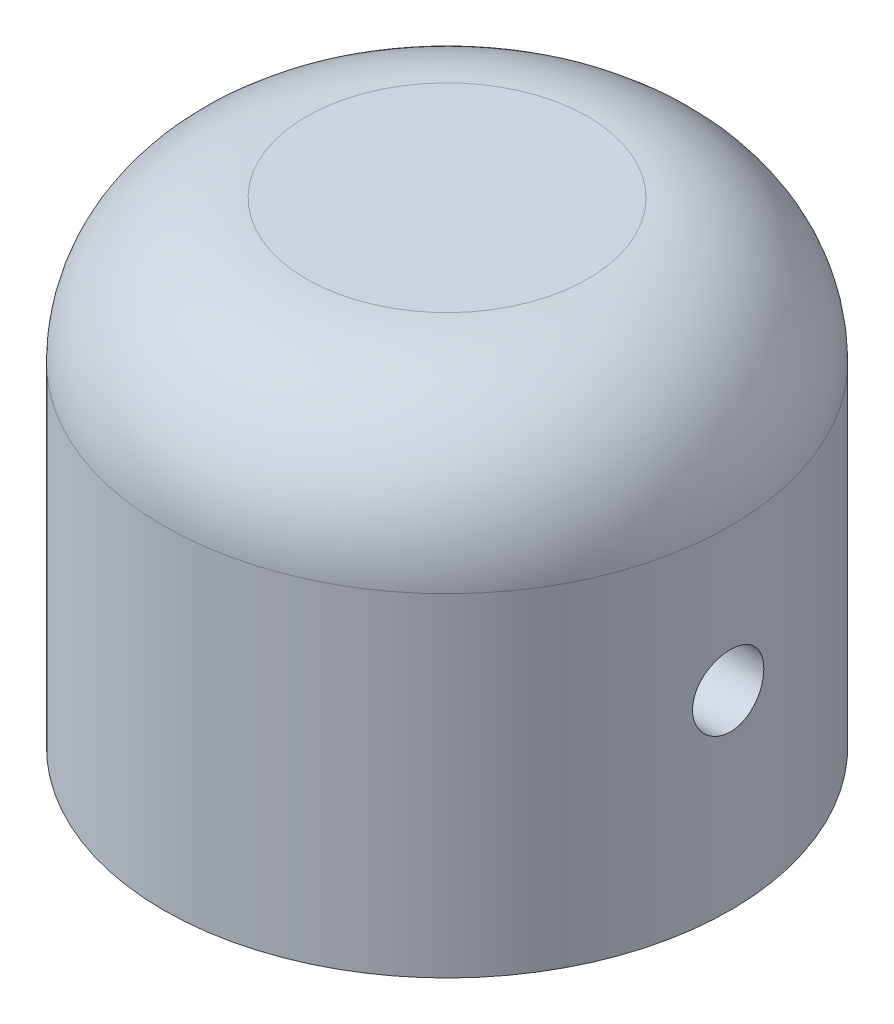
ISO-10303-21;
HEADER;
FILE_DESCRIPTION(('STEP AP214'),'2;1');
FILE_NAME('part.step','',(''),(''),'','','');
FILE_SCHEMA(('AUTOMOTIVE_DESIGN { 1 0 10303 214 1 1 1 1 }'));
ENDSEC;
DATA;
#1=APPLICATION_CONTEXT('core data for automotive mechanical design processes');
#2=APPLICATION_PROTOCOL_DEFINITION('international standard','automotive_design',2000,#1);
#3=PRODUCT_CONTEXT('',#1,'mechanical');
#4=PRODUCT('Part','Part','',(#3));
#5=PRODUCT_RELATED_PRODUCT_CATEGORY('part','',(#4));
#6=PRODUCT_DEFINITION_FORMATION('','',#4);
#7=PRODUCT_DEFINITION_CONTEXT('part definition',#1,'design');
#8=PRODUCT_DEFINITION('design','',#6,#7);
#9=PRODUCT_DEFINITION_SHAPE('','',#8);
#10=(LENGTH_UNIT() NAMED_UNIT(*) SI_UNIT(.MILLI.,.METRE.));
#11=(NAMED_UNIT(*) PLANE_ANGLE_UNIT() SI_UNIT($,.RADIAN.));
#12=(NAMED_UNIT(*) SI_UNIT($,.STERADIAN.) SOLID_ANGLE_UNIT());
#13=UNCERTAINTY_MEASURE_WITH_UNIT(LENGTH_MEASURE(1.E-05),#10,'distance_accuracy_value','');
#14=(GEOMETRIC_REPRESENTATION_CONTEXT(3) GLOBAL_UNCERTAINTY_ASSIGNED_CONTEXT((#13)) GLOBAL_UNIT_ASSIGNED_CONTEXT((#10,
#11,#12)) REPRESENTATION_CONTEXT('',''));
#15=CARTESIAN_POINT('',(0.,0.,0.));
#16=DIRECTION('',(0.,0.,1.));
#17=DIRECTION('',(1.,0.,0.));
#18=AXIS2_PLACEMENT_3D('',#15,#16,#17);
#19=CARTESIAN_POINT('',(0.,15.875,0.));
#20=DIRECTION('',(0.,1.,0.));
#21=DIRECTION('',(0.,0.,1.));
#22=AXIS2_PLACEMENT_3D('',#19,#20,#21);
#23=PLANE('',#22);
#24=CARTESIAN_POINT('',(0.,15.875,0.));
#25=DIRECTION('',(0.,1.,0.));
#26=DIRECTION('',(0.,0.,1.));
#27=AXIS2_PLACEMENT_3D('',#24,#25,#26);
#28=CIRCLE('',#27,4.699);
#29=CARTESIAN_POINT('',(0.,15.875,4.699));
#30=VERTEX_POINT('',#29);
#31=EDGE_CURVE('E42',#30,#30,#28,.T.);
#32=ORIENTED_EDGE('',*,*,#31,.T.);
#33=EDGE_LOOP('',(#32));
#34=FACE_BOUND('',#33,.T.);
#35=ADVANCED_FACE('F34',(#34),#23,.T.);
#36=CARTESIAN_POINT('',(0.,15.875,0.));
#37=DIRECTION('',(0.,-1.,0.));
#38=DIRECTION('',(0.,0.,-1.));
#39=AXIS2_PLACEMENT_3D('',#36,#37,#38);
#40=CYLINDRICAL_SURFACE('',#39,9.4615);
#41=CARTESIAN_POINT('',(9.4615,5.1595,0.));
#42=CARTESIAN_POINT('',(9.46149906596584,5.15950282668313,0.066588659575243));
#43=CARTESIAN_POINT('',(9.4607896157277,5.16510562798681,0.133218839525624));
#44=CARTESIAN_POINT('',(9.45802772090148,5.18736771487093,0.264624858635357));
#45=CARTESIAN_POINT('',(9.45597387690778,5.2040385216119,0.329398692074264));
#46=CARTESIAN_POINT('',(9.4507545539543,5.24793746563717,0.455170643416512));
#47=CARTESIAN_POINT('',(9.44758982616721,5.27515847023557,0.516171280029051));
#48=CARTESIAN_POINT('',(9.44050064867311,5.33936945200389,0.632726980340188));
#49=CARTESIAN_POINT('',(9.43657632856556,5.37635776309564,0.688282970556483));
#50=CARTESIAN_POINT('',(9.42838159703156,5.45927383765256,0.792693591939381));
#51=CARTESIAN_POINT('',(9.42410956032087,5.50524517641948,0.841513494403032));
#52=CARTESIAN_POINT('',(9.41571397386177,5.60472878781052,0.930767015448583));
#53=CARTESIAN_POINT('',(9.4115904317186,5.65824144598017,0.971200205003319));
#54=CARTESIAN_POINT('',(9.40394271969309,5.77151457225456,1.04266207341816));
#55=CARTESIAN_POINT('',(9.40042064348009,5.83129574058673,1.07365818402688));
#56=CARTESIAN_POINT('',(9.3943960953981,5.9552666630282,1.1251580332919));
#57=CARTESIAN_POINT('',(9.39189358436299,6.0194562476795,1.14566217500016));
#58=CARTESIAN_POINT('',(9.38820704002362,6.15006132322164,1.17549045230903));
#59=CARTESIAN_POINT('',(9.38701609088407,6.2164632177756,1.18487325069741));
#60=CARTESIAN_POINT('',(9.38606635157953,6.34990900898111,1.19237402677415));
#61=CARTESIAN_POINT('',(9.38630750308382,6.41695287937335,1.19049246327003));
#62=CARTESIAN_POINT('',(9.38818838932143,6.54937049147353,1.17556607519843));
#63=CARTESIAN_POINT('',(9.38982002530409,6.61475165109168,1.16258589207743));
#64=CARTESIAN_POINT('',(9.3942854028776,6.7424003330337,1.1259315908734));
#65=CARTESIAN_POINT('',(9.39711916911918,6.80466779147915,1.10225725349683));
#66=CARTESIAN_POINT('',(9.40367868676411,6.92452221544236,1.04481725967442));
#67=CARTESIAN_POINT('',(9.40740691340545,6.98209558799857,1.01102353432127));
#68=CARTESIAN_POINT('',(9.41533336265991,7.09077858584171,0.934324121714159));
#69=CARTESIAN_POINT('',(9.41953160704978,7.14188791140429,0.891418012184954));
#70=CARTESIAN_POINT('',(9.42796104722676,7.23656719125661,0.797353636632716));
#71=CARTESIAN_POINT('',(9.43219226778903,7.28008181109618,0.746139657406739));
#72=CARTESIAN_POINT('',(9.44018339014757,7.35790553985304,0.637105088674474));
#73=CARTESIAN_POINT('',(9.44394329083234,7.39221462706134,0.579284483588536));
#74=CARTESIAN_POINT('',(9.45057051192289,7.4506535082624,0.458635144775483));
#75=CARTESIAN_POINT('',(9.45343752629384,7.47477981313304,0.395804703185195));
#76=CARTESIAN_POINT('',(9.45795316943155,7.51212421753275,0.266940311561336));
#77=CARTESIAN_POINT('',(9.45960185599863,7.52534283455148,0.200906513660884));
#78=CARTESIAN_POINT('',(9.46148756290753,7.5404248609902,0.0679882890492333));
#79=CARTESIAN_POINT('',(9.46173405876669,7.54236449186576,0.0011126402089617));
#80=CARTESIAN_POINT('',(9.46081320061819,7.53503467185266,-0.132010372648206));
#81=CARTESIAN_POINT('',(9.45964587712826,7.52576546291022,-0.198257750195421));
#82=CARTESIAN_POINT('',(9.45603444940972,7.49634440410565,-0.328018614949844));
#83=CARTESIAN_POINT('',(9.45359461277404,7.47622892151655,-0.391540476699572));
#84=CARTESIAN_POINT('',(9.44771130283655,7.42572414664262,-0.51430922697737));
#85=CARTESIAN_POINT('',(9.44426779504631,7.39533450130832,-0.573555968515238));
#86=CARTESIAN_POINT('',(9.4367373982715,7.32495980820272,-0.686432929531707));
#87=CARTESIAN_POINT('',(9.43264724363259,7.28492548469742,-0.740032205766479));
#88=CARTESIAN_POINT('',(9.42429124372037,7.19646754134716,-0.839777873574327));
#89=CARTESIAN_POINT('',(9.42002539138251,7.14804358391606,-0.885923965098123));
#90=CARTESIAN_POINT('',(9.41176952560808,7.04384509244121,-0.969723986859614));
#91=CARTESIAN_POINT('',(9.40778124602669,6.98802975268564,-1.00732737426754));
#92=CARTESIAN_POINT('',(9.40056067333179,6.87083078713045,-1.07262532934591));
#93=CARTESIAN_POINT('',(9.39732836489482,6.80944727423208,-1.10032009786898));
#94=CARTESIAN_POINT('',(9.39199753496825,6.68301712204645,-1.14493294207861));
#95=CARTESIAN_POINT('',(9.38989602375003,6.61798064930239,-1.16187945664298));
#96=CARTESIAN_POINT('',(9.38705616853037,6.48595699693708,-1.18460629400509));
#97=CARTESIAN_POINT('',(9.38631776020455,6.41896990951624,-1.19038714370753));
#98=CARTESIAN_POINT('',(9.38628960579718,6.28544940967039,-1.19060880071313));
#99=CARTESIAN_POINT('',(9.38698971569464,6.21891611725704,-1.18512901478158));
#100=CARTESIAN_POINT('',(9.38973789626146,6.08772424313161,-1.16315316458393));
#101=CARTESIAN_POINT('',(9.39178596701567,6.02306566153757,-1.14665709962421));
#102=CARTESIAN_POINT('',(9.39699615283194,5.89746942918195,-1.10314188152334));
#103=CARTESIAN_POINT('',(9.40015785734223,5.83653041686621,-1.0761266060034));
#104=CARTESIAN_POINT('',(9.40723973791408,5.72003777507369,-1.01234764577126));
#105=CARTESIAN_POINT('',(9.41115992397673,5.66448421662223,-0.975583832515715));
#106=CARTESIAN_POINT('',(9.41935017457557,5.55993360634851,-0.893056968016694));
#107=CARTESIAN_POINT('',(9.4236224256859,5.51098342843723,-0.847234746512957));
#108=CARTESIAN_POINT('',(9.43201615793074,5.42143675769722,-0.748015265743746));
#109=CARTESIAN_POINT('',(9.43613760329742,5.38084223622245,-0.694616223884186));
#110=CARTESIAN_POINT('',(9.44378290135827,5.30902584977943,-0.581522783442978));
#111=CARTESIAN_POINT('',(9.44730439097828,5.2778406905229,-0.521804927537089));
#112=CARTESIAN_POINT('',(9.45332907361182,5.2259859686085,-0.397968779693651));
#113=CARTESIAN_POINT('',(9.4558333709343,5.20530499599625,-0.333855348679785));
#114=CARTESIAN_POINT('',(9.45893879090484,5.17998821312191,-0.224509640411745));
#115=CARTESIAN_POINT('',(9.459894557448,5.17231619657522,-0.179966466790286));
#116=CARTESIAN_POINT('',(9.46117547631287,5.16207115076817,-0.0902885564593098));
#117=CARTESIAN_POINT('',(9.46150063336933,5.15949808322387,-0.0451538241938961));
#118=CARTESIAN_POINT('',(9.4615,5.1595,0.));
#119=B_SPLINE_CURVE_WITH_KNOTS('',3,(#41,#42,#43,#44,#45,#46,#47,#48,#49,#50,#51,#52,#53,#54,
#55,#56,#57,#58,#59,#60,#61,#62,#63,#64,#65,#66,#67,#68,#69,#70,#71,#72,#73,#74,#75,#76,#77,#78,
#79,#80,#81,#82,#83,#84,#85,#86,#87,#88,#89,#90,#91,#92,#93,#94,#95,#96,#97,#98,#99,#100,#101,
#102,#103,#104,#105,#106,#107,#108,#109,#110,#111,#112,#113,#114,#115,#116,#117,#118),
.UNSPECIFIED.,.T.,.F.,(4,2,2,2,2,2,2,2,2,2,2,2,2,2,2,2,2,2,2,2,2,2,2,2,2,2,2,2,2,2,2,2,2,2,2,2,
2,2,4),(0.,0.199601044076262,0.399410187869891,0.599084481414063,0.798724737086445,
0.999358599220666,1.20000272236664,1.40133163701508,1.6026528169755,1.80290727534693,
2.0031535772308,2.20224147193915,2.40133344931458,2.60098286065104,2.80064152592214,
3.00169911983257,3.20275718788392,3.40388409249927,3.60500145457159,3.8047581060076,
4.00451044571233,4.2035971484811,4.40269069313103,4.60282384518157,4.80296505215779,
5.00426122297069,5.2055533131789,5.40631055666339,5.60705832623685,5.80639533891689,
6.00573236414797,6.20499597865714,6.4042622207693,6.60487586430277,6.8055367845923,
7.00697064870078,7.20818523900201,7.3435358855079,7.4788855157697),.UNSPECIFIED.);
#120=CARTESIAN_POINT('',(9.4615,5.1595,0.));
#121=VERTEX_POINT('',#120);
#122=EDGE_CURVE('E75',#121,#121,#119,.T.);
#123=ORIENTED_EDGE('',*,*,#122,.T.);
#124=EDGE_LOOP('',(#123));
#125=FACE_BOUND('',#124,.T.);
#126=CARTESIAN_POINT('',(0.,11.1125,0.));
#127=DIRECTION('',(0.,1.,0.));
#128=DIRECTION('',(0.,0.,1.));
#129=AXIS2_PLACEMENT_3D('',#126,#127,#128);
#130=CIRCLE('',#129,9.4615);
#131=CARTESIAN_POINT('',(0.,11.1125,9.4615));
#132=VERTEX_POINT('',#131);
#133=EDGE_CURVE('E11',#132,#132,#130,.F.);
#134=ORIENTED_EDGE('',*,*,#133,.T.);
#135=EDGE_LOOP('',(#134));
#136=FACE_BOUND('',#135,.T.);
#137=CARTESIAN_POINT('',(0.,0.,0.));
#138=DIRECTION('',(0.,1.,0.));
#139=DIRECTION('',(0.,0.,1.));
#140=AXIS2_PLACEMENT_3D('',#137,#138,#139);
#141=CIRCLE('',#140,9.4615);
#142=CARTESIAN_POINT('',(0.,0.,9.4615));
#143=VERTEX_POINT('',#142);
#144=EDGE_CURVE('E65',#143,#143,#141,.T.);
#145=ORIENTED_EDGE('',*,*,#144,.T.);
#146=EDGE_LOOP('',(#145));
#147=FACE_BOUND('',#146,.T.);
#148=ADVANCED_FACE('F104',(#125,#136,#147),#40,.T.);
#149=CARTESIAN_POINT('',(0.,0.,0.));
#150=DIRECTION('',(0.,1.,0.));
#151=DIRECTION('',(0.,0.,1.));
#152=AXIS2_PLACEMENT_3D('',#149,#150,#151);
#153=PLANE('',#152);
#154=DIRECTION('',(0.,0.,1.));
#155=VECTOR('',#154,1.);
#156=CARTESIAN_POINT('',(4.889,0.,-4.2484359474988));
#157=LINE('',#156,#155);
#158=CARTESIAN_POINT('',(4.889,0.,-4.2484359474988));
#159=VERTEX_POINT('',#158);
#160=CARTESIAN_POINT('',(4.889,0.,4.2484359474988));
#161=VERTEX_POINT('',#160);
#162=EDGE_CURVE('E69',#159,#161,#157,.T.);
#163=ORIENTED_EDGE('',*,*,#162,.F.);
#164=CARTESIAN_POINT('',(0.,0.,0.));
#165=DIRECTION('',(0.,-1.,0.));
#166=DIRECTION('',(0.,0.,-1.));
#167=AXIS2_PLACEMENT_3D('',#164,#165,#166);
#168=CIRCLE('',#167,6.477);
#169=EDGE_CURVE('E49',#161,#159,#168,.T.);
#170=ORIENTED_EDGE('',*,*,#169,.F.);
#171=EDGE_LOOP('',(#163,#170));
#172=FACE_BOUND('',#171,.T.);
#173=ORIENTED_EDGE('',*,*,#144,.F.);
#174=EDGE_LOOP('',(#173));
#175=FACE_BOUND('',#174,.T.);
#176=ADVANCED_FACE('F73',(#172,#175),#153,.F.);
#177=CARTESIAN_POINT('',(0.,12.7,0.));
#178=DIRECTION('',(0.,-1.,0.));
#179=DIRECTION('',(0.,0.,-1.));
#180=AXIS2_PLACEMENT_3D('',#177,#178,#179);
#181=CYLINDRICAL_SURFACE('',#180,6.477);
#182=ORIENTED_EDGE('',*,*,#169,.T.);
#183=DIRECTION('',(0.,-1.,0.));
#184=VECTOR('',#183,1.);
#185=CARTESIAN_POINT('',(4.889,12.7,-4.2484359474988));
#186=LINE('',#185,#184);
#187=CARTESIAN_POINT('',(4.889,12.7,-4.2484359474988));
#188=VERTEX_POINT('',#187);
#189=EDGE_CURVE('E66',#188,#159,#186,.T.);
#190=ORIENTED_EDGE('',*,*,#189,.F.);
#191=CARTESIAN_POINT('',(0.,12.7,0.));
#192=DIRECTION('',(0.,-1.,0.));
#193=DIRECTION('',(0.,0.,-1.));
#194=AXIS2_PLACEMENT_3D('',#191,#192,#193);
#195=CIRCLE('',#194,6.477);
#196=CARTESIAN_POINT('',(4.889,12.7,4.2484359474988));
#197=VERTEX_POINT('',#196);
#198=EDGE_CURVE('E63',#197,#188,#195,.T.);
#199=ORIENTED_EDGE('',*,*,#198,.F.);
#200=DIRECTION('',(0.,-1.,0.));
#201=VECTOR('',#200,1.);
#202=CARTESIAN_POINT('',(4.889,12.7,4.2484359474988));
#203=LINE('',#202,#201);
#204=EDGE_CURVE('E57',#197,#161,#203,.T.);
#205=ORIENTED_EDGE('',*,*,#204,.T.);
#206=EDGE_LOOP('',(#182,#190,#199,#205));
#207=FACE_BOUND('',#206,.T.);
#208=ADVANCED_FACE('F61',(#207),#181,.F.);
#209=CARTESIAN_POINT('',(4.889,12.7,-4.2484359474988));
#210=DIRECTION('',(1.,0.,0.));
#211=DIRECTION('',(0.,0.,-1.));
#212=AXIS2_PLACEMENT_3D('',#209,#210,#211);
#213=PLANE('',#212);
#214=CARTESIAN_POINT('',(4.889,6.35,0.));
#215=DIRECTION('',(-1.,0.,0.));
#216=DIRECTION('',(0.,0.,1.));
#217=AXIS2_PLACEMENT_3D('',#214,#215,#216);
#218=CIRCLE('',#217,1.1905);
#219=CARTESIAN_POINT('',(4.889,6.35,1.1905));
#220=VERTEX_POINT('',#219);
#221=EDGE_CURVE('E78',#220,#220,#218,.T.);
#222=ORIENTED_EDGE('',*,*,#221,.F.);
#223=EDGE_LOOP('',(#222));
#224=FACE_BOUND('',#223,.T.);
#225=ORIENTED_EDGE('',*,*,#162,.T.);
#226=ORIENTED_EDGE('',*,*,#204,.F.);
#227=DIRECTION('',(0.,0.,1.));
#228=VECTOR('',#227,1.);
#229=CARTESIAN_POINT('',(4.889,12.7,-4.2484359474988));
#230=LINE('',#229,#228);
#231=EDGE_CURVE('E81',#188,#197,#230,.T.);
#232=ORIENTED_EDGE('',*,*,#231,.F.);
#233=ORIENTED_EDGE('',*,*,#189,.T.);
#234=EDGE_LOOP('',(#225,#226,#232,#233));
#235=FACE_BOUND('',#234,.T.);
#236=ADVANCED_FACE('F70',(#224,#235),#213,.F.);
#237=CARTESIAN_POINT('',(0.,12.7,0.));
#238=DIRECTION('',(0.,-1.,0.));
#239=DIRECTION('',(0.,0.,-1.));
#240=AXIS2_PLACEMENT_3D('',#237,#238,#239);
#241=PLANE('',#240);
#242=ORIENTED_EDGE('',*,*,#198,.T.);
#243=ORIENTED_EDGE('',*,*,#231,.T.);
#244=EDGE_LOOP('',(#242,#243));
#245=FACE_BOUND('',#244,.T.);
#246=ADVANCED_FACE('F92',(#245),#241,.T.);
#247=CARTESIAN_POINT('',(0.,11.1125,0.));
#248=DIRECTION('',(0.,1.,0.));
#249=DIRECTION('',(0.,0.,1.));
#250=AXIS2_PLACEMENT_3D('',#247,#248,#249);
#251=DEGENERATE_TOROIDAL_SURFACE('',#250,4.699,4.7625,.T.);
#252=ORIENTED_EDGE('',*,*,#133,.F.);
#253=EDGE_LOOP('',(#252));
#254=FACE_BOUND('',#253,.T.);
#255=ORIENTED_EDGE('',*,*,#31,.F.);
#256=EDGE_LOOP('',(#255));
#257=FACE_BOUND('',#256,.T.);
#258=ADVANCED_FACE('F36',(#254,#257),#251,.T.);
#259=CARTESIAN_POINT('',(9.4615,6.35,0.));
#260=DIRECTION('',(-1.,0.,0.));
#261=DIRECTION('',(0.,0.,1.));
#262=AXIS2_PLACEMENT_3D('',#259,#260,#261);
#263=CYLINDRICAL_SURFACE('',#262,1.1905);
#264=ORIENTED_EDGE('',*,*,#221,.T.);
#265=EDGE_LOOP('',(#264));
#266=FACE_BOUND('',#265,.T.);
#267=ORIENTED_EDGE('',*,*,#122,.F.);
#268=EDGE_LOOP('',(#267));
#269=FACE_BOUND('',#268,.T.);
#270=ADVANCED_FACE('F91',(#266,#269),#263,.F.);
#271=CLOSED_SHELL('',(#35,#148,#176,#208,#236,#246,#258,#270));
#272=MANIFOLD_SOLID_BREP('B2',#271);
#273=ADVANCED_BREP_SHAPE_REPRESENTATION('',(#18,#272),#14);
#274=SHAPE_DEFINITION_REPRESENTATION(#9,#273);
ENDSEC;
END-ISO-10303-21;
